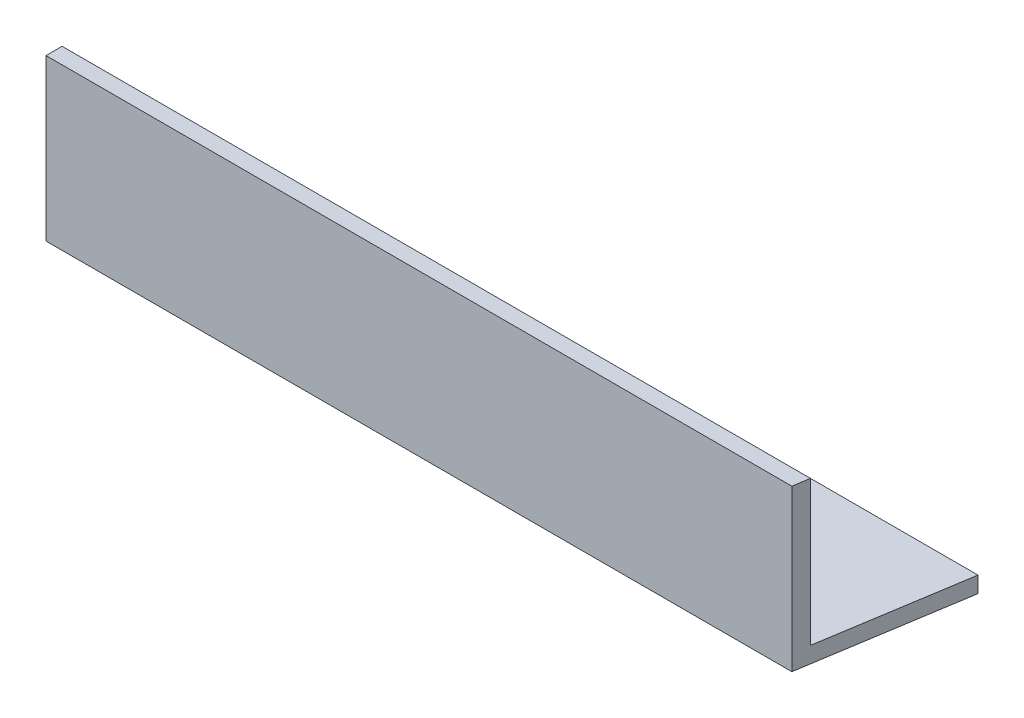
ISO-10303-21;
HEADER;
FILE_DESCRIPTION(('STEP AP214'),'2;1');
FILE_NAME('part.step','',(''),(''),'','','');
FILE_SCHEMA(('AUTOMOTIVE_DESIGN { 1 0 10303 214 1 1 1 1 }'));
ENDSEC;
DATA;
#1=APPLICATION_CONTEXT('core data for automotive mechanical design processes');
#2=APPLICATION_PROTOCOL_DEFINITION('international standard','automotive_design',2000,#1);
#3=PRODUCT_CONTEXT('',#1,'mechanical');
#4=PRODUCT('Part','Part','',(#3));
#5=PRODUCT_RELATED_PRODUCT_CATEGORY('part','',(#4));
#6=PRODUCT_DEFINITION_FORMATION('','',#4);
#7=PRODUCT_DEFINITION_CONTEXT('part definition',#1,'design');
#8=PRODUCT_DEFINITION('design','',#6,#7);
#9=PRODUCT_DEFINITION_SHAPE('','',#8);
#10=(LENGTH_UNIT() NAMED_UNIT(*) SI_UNIT(.MILLI.,.METRE.));
#11=(NAMED_UNIT(*) PLANE_ANGLE_UNIT() SI_UNIT($,.RADIAN.));
#12=(NAMED_UNIT(*) SI_UNIT($,.STERADIAN.) SOLID_ANGLE_UNIT());
#13=UNCERTAINTY_MEASURE_WITH_UNIT(LENGTH_MEASURE(1.E-05),#10,'distance_accuracy_value','');
#14=(GEOMETRIC_REPRESENTATION_CONTEXT(3) GLOBAL_UNCERTAINTY_ASSIGNED_CONTEXT((#13)) GLOBAL_UNIT_ASSIGNED_CONTEXT((#10,
#11,#12)) REPRESENTATION_CONTEXT('',''));
#15=CARTESIAN_POINT('',(0.,0.,0.));
#16=DIRECTION('',(0.,0.,1.));
#17=DIRECTION('',(1.,0.,0.));
#18=AXIS2_PLACEMENT_3D('',#15,#16,#17);
#19=CARTESIAN_POINT('',(96.,20.,0.));
#20=DIRECTION('',(0.,-1.,0.));
#21=DIRECTION('',(0.,0.,-1.));
#22=AXIS2_PLACEMENT_3D('',#19,#20,#21);
#23=PLANE('',#22);
#24=DIRECTION('',(-0.156434465040223,0.,0.987688340595139));
#25=VECTOR('',#24,1.);
#26=CARTESIAN_POINT('',(96.,20.,-20.));
#27=LINE('',#26,#25);
#28=CARTESIAN_POINT('',(93.1490800741585,20.,-2.));
#29=VERTEX_POINT('',#28);
#30=CARTESIAN_POINT('',(92.8323111935094,20.,0.));
#31=VERTEX_POINT('',#30);
#32=EDGE_CURVE('E135',#29,#31,#27,.T.);
#33=ORIENTED_EDGE('',*,*,#32,.F.);
#34=DIRECTION('',(-1.,0.,0.));
#35=VECTOR('',#34,1.);
#36=CARTESIAN_POINT('',(96.,20.,-2.));
#37=LINE('',#36,#35);
#38=CARTESIAN_POINT('',(0.,20.,-2.));
#39=VERTEX_POINT('',#38);
#40=EDGE_CURVE('E89',#29,#39,#37,.T.);
#41=ORIENTED_EDGE('',*,*,#40,.T.);
#42=DIRECTION('',(0.,0.,1.));
#43=VECTOR('',#42,1.);
#44=CARTESIAN_POINT('',(0.,20.,0.));
#45=LINE('',#44,#43);
#46=CARTESIAN_POINT('',(0.,20.,0.));
#47=VERTEX_POINT('',#46);
#48=EDGE_CURVE('E103',#39,#47,#45,.T.);
#49=ORIENTED_EDGE('',*,*,#48,.T.);
#50=DIRECTION('',(-1.,0.,0.));
#51=VECTOR('',#50,1.);
#52=CARTESIAN_POINT('',(96.,20.,0.));
#53=LINE('',#52,#51);
#54=EDGE_CURVE('E11',#31,#47,#53,.T.);
#55=ORIENTED_EDGE('',*,*,#54,.F.);
#56=EDGE_LOOP('',(#33,#41,#49,#55));
#57=FACE_BOUND('',#56,.T.);
#58=ADVANCED_FACE('F39',(#57),#23,.F.);
#59=CARTESIAN_POINT('',(96.,20.,0.));
#60=DIRECTION('',(0.,0.,-1.));
#61=DIRECTION('',(-1.,0.,0.));
#62=AXIS2_PLACEMENT_3D('',#59,#60,#61);
#63=PLANE('',#62);
#64=DIRECTION('',(0.,-1.,0.));
#65=VECTOR('',#64,1.);
#66=CARTESIAN_POINT('',(92.8323111935094,20.,0.));
#67=LINE('',#66,#65);
#68=CARTESIAN_POINT('',(92.8323111935094,0.,0.));
#69=VERTEX_POINT('',#68);
#70=EDGE_CURVE('E133',#31,#69,#67,.T.);
#71=ORIENTED_EDGE('',*,*,#70,.F.);
#72=ORIENTED_EDGE('',*,*,#54,.T.);
#73=DIRECTION('',(0.,-1.,0.));
#74=VECTOR('',#73,1.);
#75=CARTESIAN_POINT('',(0.,20.,0.));
#76=LINE('',#75,#74);
#77=CARTESIAN_POINT('',(0.,0.,0.));
#78=VERTEX_POINT('',#77);
#79=EDGE_CURVE('E122',#47,#78,#76,.T.);
#80=ORIENTED_EDGE('',*,*,#79,.T.);
#81=DIRECTION('',(-1.,0.,0.));
#82=VECTOR('',#81,1.);
#83=CARTESIAN_POINT('',(96.,0.,0.));
#84=LINE('',#83,#82);
#85=EDGE_CURVE('E47',#69,#78,#84,.T.);
#86=ORIENTED_EDGE('',*,*,#85,.F.);
#87=EDGE_LOOP('',(#71,#72,#80,#86));
#88=FACE_BOUND('',#87,.T.);
#89=ADVANCED_FACE('F123',(#88),#63,.F.);
#90=CARTESIAN_POINT('',(96.,0.,0.));
#91=DIRECTION('',(0.,1.,0.));
#92=DIRECTION('',(0.,0.,1.));
#93=AXIS2_PLACEMENT_3D('',#90,#91,#92);
#94=PLANE('',#93);
#95=DIRECTION('',(-0.156434465040223,0.,0.987688340595139));
#96=VECTOR('',#95,1.);
#97=CARTESIAN_POINT('',(96.,0.,-20.));
#98=LINE('',#97,#96);
#99=CARTESIAN_POINT('',(96.,0.,-20.));
#100=VERTEX_POINT('',#99);
#101=EDGE_CURVE('E54',#100,#69,#98,.T.);
#102=ORIENTED_EDGE('',*,*,#101,.T.);
#103=ORIENTED_EDGE('',*,*,#85,.T.);
#104=DIRECTION('',(0.,0.,-1.));
#105=VECTOR('',#104,1.);
#106=CARTESIAN_POINT('',(0.,0.,0.));
#107=LINE('',#106,#105);
#108=CARTESIAN_POINT('',(0.,0.,-20.));
#109=VERTEX_POINT('',#108);
#110=EDGE_CURVE('E118',#78,#109,#107,.T.);
#111=ORIENTED_EDGE('',*,*,#110,.T.);
#112=DIRECTION('',(-1.,0.,0.));
#113=VECTOR('',#112,1.);
#114=CARTESIAN_POINT('',(96.,0.,-20.));
#115=LINE('',#114,#113);
#116=EDGE_CURVE('E111',#100,#109,#115,.T.);
#117=ORIENTED_EDGE('',*,*,#116,.F.);
#118=EDGE_LOOP('',(#102,#103,#111,#117));
#119=FACE_BOUND('',#118,.T.);
#120=ADVANCED_FACE('F116',(#119),#94,.F.);
#121=CARTESIAN_POINT('',(96.,2.,-20.));
#122=DIRECTION('',(0.,-1.,0.));
#123=DIRECTION('',(0.,0.,-1.));
#124=AXIS2_PLACEMENT_3D('',#121,#122,#123);
#125=PLANE('',#124);
#126=DIRECTION('',(-0.156434465040223,0.,0.987688340595139));
#127=VECTOR('',#126,1.);
#128=CARTESIAN_POINT('',(96.,2.,-20.));
#129=LINE('',#128,#127);
#130=CARTESIAN_POINT('',(96.,2.,-20.));
#131=VERTEX_POINT('',#130);
#132=CARTESIAN_POINT('',(93.1490800741585,2.,-2.));
#133=VERTEX_POINT('',#132);
#134=EDGE_CURVE('E128',#131,#133,#129,.T.);
#135=ORIENTED_EDGE('',*,*,#134,.F.);
#136=DIRECTION('',(-1.,0.,0.));
#137=VECTOR('',#136,1.);
#138=CARTESIAN_POINT('',(96.,2.,-20.));
#139=LINE('',#138,#137);
#140=CARTESIAN_POINT('',(0.,2.,-20.));
#141=VERTEX_POINT('',#140);
#142=EDGE_CURVE('E88',#131,#141,#139,.T.);
#143=ORIENTED_EDGE('',*,*,#142,.T.);
#144=DIRECTION('',(0.,0.,1.));
#145=VECTOR('',#144,1.);
#146=CARTESIAN_POINT('',(0.,2.,-20.));
#147=LINE('',#146,#145);
#148=CARTESIAN_POINT('',(0.,2.,-2.));
#149=VERTEX_POINT('',#148);
#150=EDGE_CURVE('E93',#141,#149,#147,.T.);
#151=ORIENTED_EDGE('',*,*,#150,.T.);
#152=DIRECTION('',(-1.,0.,0.));
#153=VECTOR('',#152,1.);
#154=CARTESIAN_POINT('',(96.,2.,-2.));
#155=LINE('',#154,#153);
#156=EDGE_CURVE('E77',#133,#149,#155,.T.);
#157=ORIENTED_EDGE('',*,*,#156,.F.);
#158=EDGE_LOOP('',(#135,#143,#151,#157));
#159=FACE_BOUND('',#158,.T.);
#160=ADVANCED_FACE('F94',(#159),#125,.F.);
#161=CARTESIAN_POINT('',(96.,2.,-2.));
#162=DIRECTION('',(0.,0.,1.));
#163=DIRECTION('',(0.,-1.,0.));
#164=AXIS2_PLACEMENT_3D('',#161,#162,#163);
#165=PLANE('',#164);
#166=DIRECTION('',(0.,1.,0.));
#167=VECTOR('',#166,1.);
#168=CARTESIAN_POINT('',(93.1490800741585,2.,-2.));
#169=LINE('',#168,#167);
#170=EDGE_CURVE('E85',#133,#29,#169,.T.);
#171=ORIENTED_EDGE('',*,*,#170,.F.);
#172=ORIENTED_EDGE('',*,*,#156,.T.);
#173=DIRECTION('',(0.,1.,0.));
#174=VECTOR('',#173,1.);
#175=CARTESIAN_POINT('',(0.,2.,-2.));
#176=LINE('',#175,#174);
#177=EDGE_CURVE('E82',#149,#39,#176,.T.);
#178=ORIENTED_EDGE('',*,*,#177,.T.);
#179=ORIENTED_EDGE('',*,*,#40,.F.);
#180=EDGE_LOOP('',(#171,#172,#178,#179));
#181=FACE_BOUND('',#180,.T.);
#182=ADVANCED_FACE('F79',(#181),#165,.F.);
#183=CARTESIAN_POINT('',(96.,0.,-20.));
#184=DIRECTION('',(0.,0.,1.));
#185=DIRECTION('',(1.,0.,0.));
#186=AXIS2_PLACEMENT_3D('',#183,#184,#185);
#187=PLANE('',#186);
#188=DIRECTION('',(0.,1.,0.));
#189=VECTOR('',#188,1.);
#190=CARTESIAN_POINT('',(0.,0.,-20.));
#191=LINE('',#190,#189);
#192=EDGE_CURVE('E98',#109,#141,#191,.T.);
#193=ORIENTED_EDGE('',*,*,#192,.T.);
#194=ORIENTED_EDGE('',*,*,#142,.F.);
#195=DIRECTION('',(0.,1.,0.));
#196=VECTOR('',#195,1.);
#197=CARTESIAN_POINT('',(96.,0.,-20.));
#198=LINE('',#197,#196);
#199=EDGE_CURVE('E104',#100,#131,#198,.T.);
#200=ORIENTED_EDGE('',*,*,#199,.F.);
#201=ORIENTED_EDGE('',*,*,#116,.T.);
#202=EDGE_LOOP('',(#193,#194,#200,#201));
#203=FACE_BOUND('',#202,.T.);
#204=ADVANCED_FACE('F149',(#203),#187,.F.);
#205=CARTESIAN_POINT('',(0.,0.,0.));
#206=DIRECTION('',(1.,0.,0.));
#207=DIRECTION('',(0.,0.,-1.));
#208=AXIS2_PLACEMENT_3D('',#205,#206,#207);
#209=PLANE('',#208);
#210=ORIENTED_EDGE('',*,*,#48,.F.);
#211=ORIENTED_EDGE('',*,*,#177,.F.);
#212=ORIENTED_EDGE('',*,*,#150,.F.);
#213=ORIENTED_EDGE('',*,*,#192,.F.);
#214=ORIENTED_EDGE('',*,*,#110,.F.);
#215=ORIENTED_EDGE('',*,*,#79,.F.);
#216=EDGE_LOOP('',(#210,#211,#212,#213,#214,#215));
#217=FACE_BOUND('',#216,.T.);
#218=ADVANCED_FACE('F100',(#217),#209,.F.);
#219=CARTESIAN_POINT('',(96.,20.,-20.));
#220=DIRECTION('',(0.987688340595139,0.,0.156434465040223));
#221=DIRECTION('',(0.156434465040223,0.,-0.987688340595139));
#222=AXIS2_PLACEMENT_3D('',#219,#220,#221);
#223=PLANE('',#222);
#224=ORIENTED_EDGE('',*,*,#134,.T.);
#225=ORIENTED_EDGE('',*,*,#170,.T.);
#226=ORIENTED_EDGE('',*,*,#32,.T.);
#227=ORIENTED_EDGE('',*,*,#70,.T.);
#228=ORIENTED_EDGE('',*,*,#101,.F.);
#229=ORIENTED_EDGE('',*,*,#199,.T.);
#230=EDGE_LOOP('',(#224,#225,#226,#227,#228,#229));
#231=FACE_BOUND('',#230,.T.);
#232=ADVANCED_FACE('F140',(#231),#223,.T.);
#233=CLOSED_SHELL('',(#58,#89,#120,#160,#182,#204,#218,#232));
#234=MANIFOLD_SOLID_BREP('B2',#233);
#235=ADVANCED_BREP_SHAPE_REPRESENTATION('',(#18,#234),#14);
#236=SHAPE_DEFINITION_REPRESENTATION(#9,#235);
ENDSEC;
END-ISO-10303-21;
